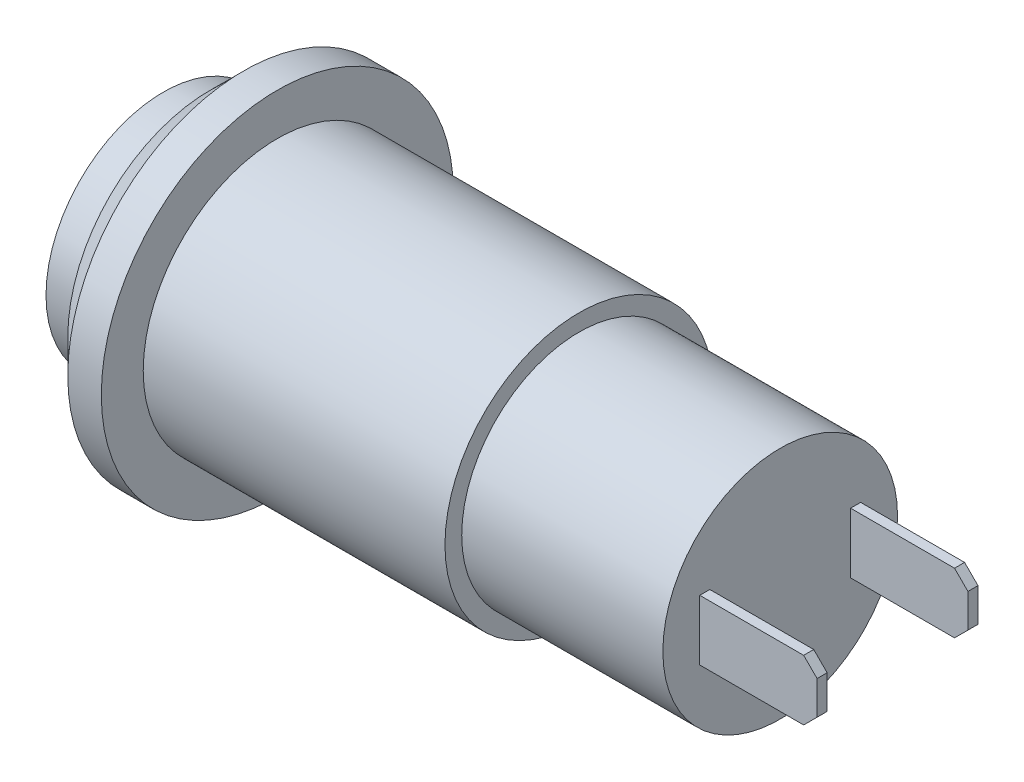
ISO-10303-21;
HEADER;
FILE_DESCRIPTION(('STEP AP214'),'2;1');
FILE_NAME('part.step','',(''),(''),'','','');
FILE_SCHEMA(('AUTOMOTIVE_DESIGN { 1 0 10303 214 1 1 1 1 }'));
ENDSEC;
DATA;
#1=APPLICATION_CONTEXT('core data for automotive mechanical design processes');
#2=APPLICATION_PROTOCOL_DEFINITION('international standard','automotive_design',2000,#1);
#3=PRODUCT_CONTEXT('',#1,'mechanical');
#4=PRODUCT('Part','Part','',(#3));
#5=PRODUCT_RELATED_PRODUCT_CATEGORY('part','',(#4));
#6=PRODUCT_DEFINITION_FORMATION('','',#4);
#7=PRODUCT_DEFINITION_CONTEXT('part definition',#1,'design');
#8=PRODUCT_DEFINITION('design','',#6,#7);
#9=PRODUCT_DEFINITION_SHAPE('','',#8);
#10=(LENGTH_UNIT() NAMED_UNIT(*) SI_UNIT(.MILLI.,.METRE.));
#11=(NAMED_UNIT(*) PLANE_ANGLE_UNIT() SI_UNIT($,.RADIAN.));
#12=(NAMED_UNIT(*) SI_UNIT($,.STERADIAN.) SOLID_ANGLE_UNIT());
#13=UNCERTAINTY_MEASURE_WITH_UNIT(LENGTH_MEASURE(1.E-05),#10,'distance_accuracy_value','');
#14=(GEOMETRIC_REPRESENTATION_CONTEXT(3) GLOBAL_UNCERTAINTY_ASSIGNED_CONTEXT((#13)) GLOBAL_UNIT_ASSIGNED_CONTEXT((#10,
#11,#12)) REPRESENTATION_CONTEXT('',''));
#15=CARTESIAN_POINT('',(0.,0.,0.));
#16=DIRECTION('',(0.,0.,1.));
#17=DIRECTION('',(1.,0.,0.));
#18=AXIS2_PLACEMENT_3D('',#15,#16,#17);
#19=CARTESIAN_POINT('',(18.4,3.5,0.));
#20=DIRECTION('',(1.,0.,0.));
#21=DIRECTION('',(0.,0.,-1.));
#22=AXIS2_PLACEMENT_3D('',#19,#20,#21);
#23=PLANE('',#22);
#24=CARTESIAN_POINT('',(18.4,0.,0.));
#25=DIRECTION('',(1.,0.,0.));
#26=DIRECTION('',(0.,0.,-1.));
#27=AXIS2_PLACEMENT_3D('',#24,#25,#26);
#28=CIRCLE('',#27,3.5);
#29=CARTESIAN_POINT('',(18.4,0.,-3.5));
#30=VERTEX_POINT('',#29);
#31=EDGE_CURVE('E214',#30,#30,#28,.T.);
#32=ORIENTED_EDGE('',*,*,#31,.T.);
#33=EDGE_LOOP('',(#32));
#34=FACE_BOUND('',#33,.T.);
#35=DIRECTION('',(0.,0.,1.));
#36=VECTOR('',#35,1.);
#37=CARTESIAN_POINT('',(18.4,0.900000000000001,2.4));
#38=LINE('',#37,#36);
#39=CARTESIAN_POINT('',(18.4,0.900000000000001,2.1));
#40=VERTEX_POINT('',#39);
#41=CARTESIAN_POINT('',(18.4,0.900000000000001,2.4));
#42=VERTEX_POINT('',#41);
#43=EDGE_CURVE('E172',#40,#42,#38,.T.);
#44=ORIENTED_EDGE('',*,*,#43,.F.);
#45=DIRECTION('',(0.,1.,0.));
#46=VECTOR('',#45,1.);
#47=CARTESIAN_POINT('',(18.4,0.900000000000001,2.1));
#48=LINE('',#47,#46);
#49=CARTESIAN_POINT('',(18.4,-0.899999999999998,2.1));
#50=VERTEX_POINT('',#49);
#51=EDGE_CURVE('E167',#50,#40,#48,.T.);
#52=ORIENTED_EDGE('',*,*,#51,.F.);
#53=DIRECTION('',(0.,0.,-1.));
#54=VECTOR('',#53,1.);
#55=CARTESIAN_POINT('',(18.4,-0.899999999999999,2.4));
#56=LINE('',#55,#54);
#57=CARTESIAN_POINT('',(18.4,-0.899999999999999,2.4));
#58=VERTEX_POINT('',#57);
#59=EDGE_CURVE('E188',#58,#50,#56,.T.);
#60=ORIENTED_EDGE('',*,*,#59,.F.);
#61=DIRECTION('',(0.,-1.,0.));
#62=VECTOR('',#61,1.);
#63=CARTESIAN_POINT('',(18.4,0.900000000000001,2.4));
#64=LINE('',#63,#62);
#65=EDGE_CURVE('E196',#42,#58,#64,.T.);
#66=ORIENTED_EDGE('',*,*,#65,.F.);
#67=EDGE_LOOP('',(#44,#52,#60,#66));
#68=FACE_BOUND('',#67,.T.);
#69=DIRECTION('',(0.,0.,1.));
#70=VECTOR('',#69,1.);
#71=CARTESIAN_POINT('',(18.4,0.900000000000001,-2.1));
#72=LINE('',#71,#70);
#73=CARTESIAN_POINT('',(18.4,0.900000000000002,-2.4));
#74=VERTEX_POINT('',#73);
#75=CARTESIAN_POINT('',(18.4,0.900000000000001,-2.1));
#76=VERTEX_POINT('',#75);
#77=EDGE_CURVE('E165',#74,#76,#72,.T.);
#78=ORIENTED_EDGE('',*,*,#77,.F.);
#79=DIRECTION('',(0.,1.,0.));
#80=VECTOR('',#79,1.);
#81=CARTESIAN_POINT('',(18.4,0.900000000000002,-2.4));
#82=LINE('',#81,#80);
#83=CARTESIAN_POINT('',(18.4,-0.899999999999998,-2.4));
#84=VERTEX_POINT('',#83);
#85=EDGE_CURVE('E144',#84,#74,#82,.T.);
#86=ORIENTED_EDGE('',*,*,#85,.F.);
#87=DIRECTION('',(0.,0.,-1.));
#88=VECTOR('',#87,1.);
#89=CARTESIAN_POINT('',(18.4,-0.899999999999998,-2.1));
#90=LINE('',#89,#88);
#91=CARTESIAN_POINT('',(18.4,-0.899999999999998,-2.1));
#92=VERTEX_POINT('',#91);
#93=EDGE_CURVE('E154',#92,#84,#90,.T.);
#94=ORIENTED_EDGE('',*,*,#93,.F.);
#95=DIRECTION('',(0.,-1.,0.));
#96=VECTOR('',#95,1.);
#97=CARTESIAN_POINT('',(18.4,0.900000000000001,-2.1));
#98=LINE('',#97,#96);
#99=EDGE_CURVE('E161',#76,#92,#98,.T.);
#100=ORIENTED_EDGE('',*,*,#99,.F.);
#101=EDGE_LOOP('',(#78,#86,#94,#100));
#102=FACE_BOUND('',#101,.T.);
#103=ADVANCED_FACE('F47',(#34,#68,#102),#23,.T.);
#104=CARTESIAN_POINT('',(0.,0.,0.));
#105=DIRECTION('',(-1.,0.,0.));
#106=DIRECTION('',(0.,0.,1.));
#107=AXIS2_PLACEMENT_3D('',#104,#105,#106);
#108=PLANE('',#107);
#109=CARTESIAN_POINT('',(0.,0.,0.));
#110=DIRECTION('',(1.,0.,0.));
#111=DIRECTION('',(0.,0.,-1.));
#112=AXIS2_PLACEMENT_3D('',#109,#110,#111);
#113=CIRCLE('',#112,3.5);
#114=CARTESIAN_POINT('',(0.,0.,-3.5));
#115=VERTEX_POINT('',#114);
#116=EDGE_CURVE('E238',#115,#115,#113,.T.);
#117=ORIENTED_EDGE('',*,*,#116,.F.);
#118=EDGE_LOOP('',(#117));
#119=FACE_BOUND('',#118,.T.);
#120=ADVANCED_FACE('F326',(#119),#108,.T.);
#121=CARTESIAN_POINT('',(18.4,0.,0.));
#122=DIRECTION('',(1.,0.,0.));
#123=DIRECTION('',(0.,0.,-1.));
#124=AXIS2_PLACEMENT_3D('',#121,#122,#123);
#125=CYLINDRICAL_SURFACE('',#124,3.5);
#126=ORIENTED_EDGE('',*,*,#116,.T.);
#127=EDGE_LOOP('',(#126));
#128=FACE_BOUND('',#127,.T.);
#129=CARTESIAN_POINT('',(1.4,0.,0.));
#130=DIRECTION('',(1.,0.,0.));
#131=DIRECTION('',(0.,0.,-1.));
#132=AXIS2_PLACEMENT_3D('',#129,#130,#131);
#133=CIRCLE('',#132,3.5);
#134=CARTESIAN_POINT('',(1.4,0.,-3.5));
#135=VERTEX_POINT('',#134);
#136=EDGE_CURVE('E234',#135,#135,#133,.T.);
#137=ORIENTED_EDGE('',*,*,#136,.F.);
#138=EDGE_LOOP('',(#137));
#139=FACE_BOUND('',#138,.T.);
#140=ADVANCED_FACE('F332',(#128,#139),#125,.T.);
#141=CARTESIAN_POINT('',(1.4,3.5,0.));
#142=DIRECTION('',(-1.,0.,0.));
#143=DIRECTION('',(0.,0.,1.));
#144=AXIS2_PLACEMENT_3D('',#141,#142,#143);
#145=PLANE('',#144);
#146=CARTESIAN_POINT('',(1.4,0.,0.));
#147=DIRECTION('',(-1.,0.,0.));
#148=DIRECTION('',(0.,0.,1.));
#149=AXIS2_PLACEMENT_3D('',#146,#147,#148);
#150=CIRCLE('',#149,4.25000000000001);
#151=CARTESIAN_POINT('',(1.4,0.,4.25000000000001));
#152=VERTEX_POINT('',#151);
#153=EDGE_CURVE('E246',#152,#152,#150,.T.);
#154=ORIENTED_EDGE('',*,*,#153,.T.);
#155=EDGE_LOOP('',(#154));
#156=FACE_BOUND('',#155,.T.);
#157=ORIENTED_EDGE('',*,*,#136,.T.);
#158=EDGE_LOOP('',(#157));
#159=FACE_BOUND('',#158,.T.);
#160=ADVANCED_FACE('F355',(#156,#159),#145,.T.);
#161=CARTESIAN_POINT('',(18.4,0.,0.));
#162=DIRECTION('',(1.,0.,0.));
#163=DIRECTION('',(0.,0.,-1.));
#164=AXIS2_PLACEMENT_3D('',#161,#162,#163);
#165=CYLINDRICAL_SURFACE('',#164,5.25);
#166=CARTESIAN_POINT('',(2.39999999999999,0.,0.));
#167=DIRECTION('',(-1.,0.,0.));
#168=DIRECTION('',(0.,0.,1.));
#169=AXIS2_PLACEMENT_3D('',#166,#167,#168);
#170=CIRCLE('',#169,5.25);
#171=CARTESIAN_POINT('',(2.39999999999999,0.,5.25));
#172=VERTEX_POINT('',#171);
#173=EDGE_CURVE('E242',#172,#172,#170,.F.);
#174=ORIENTED_EDGE('',*,*,#173,.T.);
#175=EDGE_LOOP('',(#174));
#176=FACE_BOUND('',#175,.T.);
#177=CARTESIAN_POINT('',(3.4,0.,0.));
#178=DIRECTION('',(1.,0.,0.));
#179=DIRECTION('',(0.,0.,-1.));
#180=AXIS2_PLACEMENT_3D('',#177,#178,#179);
#181=CIRCLE('',#180,5.25);
#182=CARTESIAN_POINT('',(3.4,0.,-5.25));
#183=VERTEX_POINT('',#182);
#184=EDGE_CURVE('E230',#183,#183,#181,.T.);
#185=ORIENTED_EDGE('',*,*,#184,.F.);
#186=EDGE_LOOP('',(#185));
#187=FACE_BOUND('',#186,.T.);
#188=ADVANCED_FACE('F351',(#176,#187),#165,.T.);
#189=CARTESIAN_POINT('',(3.4,5.25,0.));
#190=DIRECTION('',(1.,0.,0.));
#191=DIRECTION('',(0.,0.,-1.));
#192=AXIS2_PLACEMENT_3D('',#189,#190,#191);
#193=PLANE('',#192);
#194=ORIENTED_EDGE('',*,*,#184,.T.);
#195=EDGE_LOOP('',(#194));
#196=FACE_BOUND('',#195,.T.);
#197=CARTESIAN_POINT('',(3.4,0.,0.));
#198=DIRECTION('',(1.,0.,0.));
#199=DIRECTION('',(0.,0.,-1.));
#200=AXIS2_PLACEMENT_3D('',#197,#198,#199);
#201=CIRCLE('',#200,4.);
#202=CARTESIAN_POINT('',(3.4,0.,-4.));
#203=VERTEX_POINT('',#202);
#204=EDGE_CURVE('E226',#203,#203,#201,.T.);
#205=ORIENTED_EDGE('',*,*,#204,.F.);
#206=EDGE_LOOP('',(#205));
#207=FACE_BOUND('',#206,.T.);
#208=ADVANCED_FACE('F347',(#196,#207),#193,.T.);
#209=CARTESIAN_POINT('',(18.4,0.,0.));
#210=DIRECTION('',(1.,0.,0.));
#211=DIRECTION('',(0.,0.,-1.));
#212=AXIS2_PLACEMENT_3D('',#209,#210,#211);
#213=CYLINDRICAL_SURFACE('',#212,4.);
#214=ORIENTED_EDGE('',*,*,#204,.T.);
#215=EDGE_LOOP('',(#214));
#216=FACE_BOUND('',#215,.T.);
#217=CARTESIAN_POINT('',(12.4,0.,0.));
#218=DIRECTION('',(1.,0.,0.));
#219=DIRECTION('',(0.,0.,-1.));
#220=AXIS2_PLACEMENT_3D('',#217,#218,#219);
#221=CIRCLE('',#220,4.);
#222=CARTESIAN_POINT('',(12.4,0.,-4.));
#223=VERTEX_POINT('',#222);
#224=EDGE_CURVE('E222',#223,#223,#221,.T.);
#225=ORIENTED_EDGE('',*,*,#224,.F.);
#226=EDGE_LOOP('',(#225));
#227=FACE_BOUND('',#226,.T.);
#228=ADVANCED_FACE('F343',(#216,#227),#213,.T.);
#229=CARTESIAN_POINT('',(12.4,4.,0.));
#230=DIRECTION('',(1.,0.,0.));
#231=DIRECTION('',(0.,0.,-1.));
#232=AXIS2_PLACEMENT_3D('',#229,#230,#231);
#233=PLANE('',#232);
#234=ORIENTED_EDGE('',*,*,#224,.T.);
#235=EDGE_LOOP('',(#234));
#236=FACE_BOUND('',#235,.T.);
#237=CARTESIAN_POINT('',(12.4,0.,0.));
#238=DIRECTION('',(1.,0.,0.));
#239=DIRECTION('',(0.,0.,-1.));
#240=AXIS2_PLACEMENT_3D('',#237,#238,#239);
#241=CIRCLE('',#240,3.5);
#242=CARTESIAN_POINT('',(12.4,0.,-3.5));
#243=VERTEX_POINT('',#242);
#244=EDGE_CURVE('E218',#243,#243,#241,.T.);
#245=ORIENTED_EDGE('',*,*,#244,.F.);
#246=EDGE_LOOP('',(#245));
#247=FACE_BOUND('',#246,.T.);
#248=ADVANCED_FACE('F339',(#236,#247),#233,.T.);
#249=CARTESIAN_POINT('',(18.4,0.,0.));
#250=DIRECTION('',(1.,0.,0.));
#251=DIRECTION('',(0.,0.,-1.));
#252=AXIS2_PLACEMENT_3D('',#249,#250,#251);
#253=CYLINDRICAL_SURFACE('',#252,3.5);
#254=ORIENTED_EDGE('',*,*,#244,.T.);
#255=EDGE_LOOP('',(#254));
#256=FACE_BOUND('',#255,.T.);
#257=ORIENTED_EDGE('',*,*,#31,.F.);
#258=EDGE_LOOP('',(#257));
#259=FACE_BOUND('',#258,.T.);
#260=ADVANCED_FACE('F336',(#256,#259),#253,.T.);
#261=CARTESIAN_POINT('',(2.39999999999999,0.,0.));
#262=DIRECTION('',(1.,0.,0.));
#263=DIRECTION('',(0.,0.,-1.));
#264=AXIS2_PLACEMENT_3D('',#261,#262,#263);
#265=CONICAL_SURFACE('',#264,5.25,0.785398163397449);
#266=ORIENTED_EDGE('',*,*,#153,.F.);
#267=EDGE_LOOP('',(#266));
#268=FACE_BOUND('',#267,.T.);
#269=ORIENTED_EDGE('',*,*,#173,.F.);
#270=EDGE_LOOP('',(#269));
#271=FACE_BOUND('',#270,.T.);
#272=ADVANCED_FACE('F323',(#268,#271),#265,.T.);
#273=CARTESIAN_POINT('',(21.9,0.900000000000001,2.1));
#274=DIRECTION('',(0.,0.,1.));
#275=DIRECTION('',(1.,0.,0.));
#276=AXIS2_PLACEMENT_3D('',#273,#274,#275);
#277=PLANE('',#276);
#278=DIRECTION('',(0.,1.,0.));
#279=VECTOR('',#278,1.);
#280=CARTESIAN_POINT('',(21.9,0.900000000000001,2.1));
#281=LINE('',#280,#279);
#282=CARTESIAN_POINT('',(21.9,-0.500000000000001,2.1));
#283=VERTEX_POINT('',#282);
#284=CARTESIAN_POINT('',(21.9,0.5,2.1));
#285=VERTEX_POINT('',#284);
#286=EDGE_CURVE('E183',#283,#285,#281,.T.);
#287=ORIENTED_EDGE('',*,*,#286,.F.);
#288=DIRECTION('',(-0.707106781186551,-0.707106781186544,0.));
#289=VECTOR('',#288,1.);
#290=CARTESIAN_POINT('',(21.9,-0.499999999999999,2.1));
#291=LINE('',#290,#289);
#292=CARTESIAN_POINT('',(21.5,-0.899999999999998,2.1));
#293=VERTEX_POINT('',#292);
#294=EDGE_CURVE('E286',#283,#293,#291,.T.);
#295=ORIENTED_EDGE('',*,*,#294,.T.);
#296=DIRECTION('',(-1.,0.,0.));
#297=VECTOR('',#296,1.);
#298=CARTESIAN_POINT('',(21.9,-0.899999999999998,2.1));
#299=LINE('',#298,#297);
#300=EDGE_CURVE('E191',#293,#50,#299,.T.);
#301=ORIENTED_EDGE('',*,*,#300,.T.);
#302=ORIENTED_EDGE('',*,*,#51,.T.);
#303=DIRECTION('',(-1.,0.,0.));
#304=VECTOR('',#303,1.);
#305=CARTESIAN_POINT('',(21.9,0.900000000000001,2.1));
#306=LINE('',#305,#304);
#307=CARTESIAN_POINT('',(21.5,0.900000000000001,2.1));
#308=VERTEX_POINT('',#307);
#309=EDGE_CURVE('E211',#308,#40,#306,.T.);
#310=ORIENTED_EDGE('',*,*,#309,.F.);
#311=DIRECTION('',(0.707106781186548,-0.707106781186548,0.));
#312=VECTOR('',#311,1.);
#313=CARTESIAN_POINT('',(21.9,0.5,2.1));
#314=LINE('',#313,#312);
#315=EDGE_CURVE('E283',#308,#285,#314,.T.);
#316=ORIENTED_EDGE('',*,*,#315,.T.);
#317=EDGE_LOOP('',(#287,#295,#301,#302,#310,#316));
#318=FACE_BOUND('',#317,.T.);
#319=ADVANCED_FACE('F303',(#318),#277,.F.);
#320=CARTESIAN_POINT('',(21.9,0.900000000000001,2.4));
#321=DIRECTION('',(0.,-1.,0.));
#322=DIRECTION('',(0.,0.,-1.));
#323=AXIS2_PLACEMENT_3D('',#320,#321,#322);
#324=PLANE('',#323);
#325=DIRECTION('',(-1.,0.,0.));
#326=VECTOR('',#325,1.);
#327=CARTESIAN_POINT('',(21.9,0.900000000000001,2.4));
#328=LINE('',#327,#326);
#329=CARTESIAN_POINT('',(21.5,0.900000000000001,2.4));
#330=VERTEX_POINT('',#329);
#331=EDGE_CURVE('E208',#330,#42,#328,.T.);
#332=ORIENTED_EDGE('',*,*,#331,.F.);
#333=DIRECTION('',(0.,0.,-1.));
#334=VECTOR('',#333,1.);
#335=CARTESIAN_POINT('',(21.5,0.900000000000001,2.1));
#336=LINE('',#335,#334);
#337=EDGE_CURVE('E11',#330,#308,#336,.T.);
#338=ORIENTED_EDGE('',*,*,#337,.T.);
#339=ORIENTED_EDGE('',*,*,#309,.T.);
#340=ORIENTED_EDGE('',*,*,#43,.T.);
#341=EDGE_LOOP('',(#332,#338,#339,#340));
#342=FACE_BOUND('',#341,.T.);
#343=ADVANCED_FACE('F315',(#342),#324,.F.);
#344=CARTESIAN_POINT('',(21.9,0.900000000000001,2.4));
#345=DIRECTION('',(0.,0.,-1.));
#346=DIRECTION('',(-1.,0.,0.));
#347=AXIS2_PLACEMENT_3D('',#344,#345,#346);
#348=PLANE('',#347);
#349=DIRECTION('',(-1.,0.,0.));
#350=VECTOR('',#349,1.);
#351=CARTESIAN_POINT('',(21.9,-0.899999999999999,2.4));
#352=LINE('',#351,#350);
#353=CARTESIAN_POINT('',(21.5,-0.899999999999999,2.4));
#354=VERTEX_POINT('',#353);
#355=EDGE_CURVE('E205',#354,#58,#352,.T.);
#356=ORIENTED_EDGE('',*,*,#355,.F.);
#357=DIRECTION('',(0.707106781186551,0.707106781186544,0.));
#358=VECTOR('',#357,1.);
#359=CARTESIAN_POINT('',(21.9,-0.499999999999999,2.4));
#360=LINE('',#359,#358);
#361=CARTESIAN_POINT('',(21.9,-0.500000000000001,2.4));
#362=VERTEX_POINT('',#361);
#363=EDGE_CURVE('E57',#354,#362,#360,.T.);
#364=ORIENTED_EDGE('',*,*,#363,.T.);
#365=DIRECTION('',(0.,-1.,0.));
#366=VECTOR('',#365,1.);
#367=CARTESIAN_POINT('',(21.9,0.900000000000001,2.4));
#368=LINE('',#367,#366);
#369=CARTESIAN_POINT('',(21.9,0.5,2.4));
#370=VERTEX_POINT('',#369);
#371=EDGE_CURVE('E187',#370,#362,#368,.T.);
#372=ORIENTED_EDGE('',*,*,#371,.F.);
#373=DIRECTION('',(-0.707106781186548,0.707106781186548,0.));
#374=VECTOR('',#373,1.);
#375=CARTESIAN_POINT('',(21.9,0.5,2.4));
#376=LINE('',#375,#374);
#377=EDGE_CURVE('E64',#370,#330,#376,.T.);
#378=ORIENTED_EDGE('',*,*,#377,.T.);
#379=ORIENTED_EDGE('',*,*,#331,.T.);
#380=ORIENTED_EDGE('',*,*,#65,.T.);
#381=EDGE_LOOP('',(#356,#364,#372,#378,#379,#380));
#382=FACE_BOUND('',#381,.T.);
#383=ADVANCED_FACE('F294',(#382),#348,.F.);
#384=CARTESIAN_POINT('',(21.9,-0.899999999999999,2.4));
#385=DIRECTION('',(0.,1.,0.));
#386=DIRECTION('',(0.,0.,1.));
#387=AXIS2_PLACEMENT_3D('',#384,#385,#386);
#388=PLANE('',#387);
#389=ORIENTED_EDGE('',*,*,#300,.F.);
#390=DIRECTION('',(0.,0.,1.));
#391=VECTOR('',#390,1.);
#392=CARTESIAN_POINT('',(21.5,-0.899999999999999,2.4));
#393=LINE('',#392,#391);
#394=EDGE_CURVE('E72',#293,#354,#393,.T.);
#395=ORIENTED_EDGE('',*,*,#394,.T.);
#396=ORIENTED_EDGE('',*,*,#355,.T.);
#397=ORIENTED_EDGE('',*,*,#59,.T.);
#398=EDGE_LOOP('',(#389,#395,#396,#397));
#399=FACE_BOUND('',#398,.T.);
#400=ADVANCED_FACE('F304',(#399),#388,.F.);
#401=CARTESIAN_POINT('',(21.9,0.,0.));
#402=DIRECTION('',(1.,0.,0.));
#403=DIRECTION('',(0.,0.,-1.));
#404=AXIS2_PLACEMENT_3D('',#401,#402,#403);
#405=PLANE('',#404);
#406=ORIENTED_EDGE('',*,*,#371,.T.);
#407=DIRECTION('',(0.,0.,-1.));
#408=VECTOR('',#407,1.);
#409=CARTESIAN_POINT('',(21.9,-0.500000000000001,2.1));
#410=LINE('',#409,#408);
#411=EDGE_CURVE('E279',#362,#283,#410,.T.);
#412=ORIENTED_EDGE('',*,*,#411,.T.);
#413=ORIENTED_EDGE('',*,*,#286,.T.);
#414=DIRECTION('',(0.,0.,1.));
#415=VECTOR('',#414,1.);
#416=CARTESIAN_POINT('',(21.9,0.5,2.4));
#417=LINE('',#416,#415);
#418=EDGE_CURVE('E275',#285,#370,#417,.T.);
#419=ORIENTED_EDGE('',*,*,#418,.T.);
#420=EDGE_LOOP('',(#406,#412,#413,#419));
#421=FACE_BOUND('',#420,.T.);
#422=ADVANCED_FACE('F298',(#421),#405,.T.);
#423=CARTESIAN_POINT('',(21.9,0.900000000000002,-2.4));
#424=DIRECTION('',(0.,0.,1.));
#425=DIRECTION('',(1.,0.,0.));
#426=AXIS2_PLACEMENT_3D('',#423,#424,#425);
#427=PLANE('',#426);
#428=DIRECTION('',(0.,1.,0.));
#429=VECTOR('',#428,1.);
#430=CARTESIAN_POINT('',(21.9,0.900000000000002,-2.4));
#431=LINE('',#430,#429);
#432=CARTESIAN_POINT('',(21.9,-0.500000000000001,-2.4));
#433=VERTEX_POINT('',#432);
#434=CARTESIAN_POINT('',(21.9,0.500000000000004,-2.4));
#435=VERTEX_POINT('',#434);
#436=EDGE_CURVE('E162',#433,#435,#431,.T.);
#437=ORIENTED_EDGE('',*,*,#436,.F.);
#438=DIRECTION('',(-0.707106781186551,-0.707106781186544,0.));
#439=VECTOR('',#438,1.);
#440=CARTESIAN_POINT('',(21.9,-0.500000000000001,-2.4));
#441=LINE('',#440,#439);
#442=CARTESIAN_POINT('',(21.5,-0.899999999999998,-2.4));
#443=VERTEX_POINT('',#442);
#444=EDGE_CURVE('E146',#433,#443,#441,.T.);
#445=ORIENTED_EDGE('',*,*,#444,.T.);
#446=DIRECTION('',(-1.,0.,0.));
#447=VECTOR('',#446,1.);
#448=CARTESIAN_POINT('',(21.9,-0.899999999999998,-2.4));
#449=LINE('',#448,#447);
#450=EDGE_CURVE('E138',#443,#84,#449,.T.);
#451=ORIENTED_EDGE('',*,*,#450,.T.);
#452=ORIENTED_EDGE('',*,*,#85,.T.);
#453=DIRECTION('',(-1.,0.,0.));
#454=VECTOR('',#453,1.);
#455=CARTESIAN_POINT('',(21.9,0.900000000000002,-2.4));
#456=LINE('',#455,#454);
#457=CARTESIAN_POINT('',(21.5,0.900000000000002,-2.4));
#458=VERTEX_POINT('',#457);
#459=EDGE_CURVE('E601',#458,#74,#456,.T.);
#460=ORIENTED_EDGE('',*,*,#459,.F.);
#461=DIRECTION('',(0.707106781186551,-0.707106781186544,0.));
#462=VECTOR('',#461,1.);
#463=CARTESIAN_POINT('',(21.9,0.500000000000001,-2.4));
#464=LINE('',#463,#462);
#465=EDGE_CURVE('E258',#458,#435,#464,.T.);
#466=ORIENTED_EDGE('',*,*,#465,.T.);
#467=EDGE_LOOP('',(#437,#445,#451,#452,#460,#466));
#468=FACE_BOUND('',#467,.T.);
#469=ADVANCED_FACE('F141',(#468),#427,.F.);
#470=CARTESIAN_POINT('',(21.9,0.900000000000001,-2.1));
#471=DIRECTION('',(0.,-1.,0.));
#472=DIRECTION('',(0.,0.,-1.));
#473=AXIS2_PLACEMENT_3D('',#470,#471,#472);
#474=PLANE('',#473);
#475=DIRECTION('',(-1.,0.,0.));
#476=VECTOR('',#475,1.);
#477=CARTESIAN_POINT('',(21.9,0.900000000000001,-2.1));
#478=LINE('',#477,#476);
#479=CARTESIAN_POINT('',(21.5,0.900000000000001,-2.1));
#480=VERTEX_POINT('',#479);
#481=EDGE_CURVE('E598',#480,#76,#478,.T.);
#482=ORIENTED_EDGE('',*,*,#481,.F.);
#483=DIRECTION('',(0.,0.,-1.));
#484=VECTOR('',#483,1.);
#485=CARTESIAN_POINT('',(21.5,0.900000000000002,-2.4));
#486=LINE('',#485,#484);
#487=EDGE_CURVE('E272',#480,#458,#486,.T.);
#488=ORIENTED_EDGE('',*,*,#487,.T.);
#489=ORIENTED_EDGE('',*,*,#459,.T.);
#490=ORIENTED_EDGE('',*,*,#77,.T.);
#491=EDGE_LOOP('',(#482,#488,#489,#490));
#492=FACE_BOUND('',#491,.T.);
#493=ADVANCED_FACE('F441',(#492),#474,.F.);
#494=CARTESIAN_POINT('',(21.9,0.900000000000001,-2.1));
#495=DIRECTION('',(0.,0.,-1.));
#496=DIRECTION('',(-1.,0.,0.));
#497=AXIS2_PLACEMENT_3D('',#494,#495,#496);
#498=PLANE('',#497);
#499=DIRECTION('',(-1.,0.,0.));
#500=VECTOR('',#499,1.);
#501=CARTESIAN_POINT('',(21.9,-0.899999999999998,-2.1));
#502=LINE('',#501,#500);
#503=CARTESIAN_POINT('',(21.5,-0.899999999999998,-2.1));
#504=VERTEX_POINT('',#503);
#505=EDGE_CURVE('E151',#504,#92,#502,.T.);
#506=ORIENTED_EDGE('',*,*,#505,.F.);
#507=DIRECTION('',(0.707106781186551,0.707106781186544,0.));
#508=VECTOR('',#507,1.);
#509=CARTESIAN_POINT('',(21.9,-0.500000000000001,-2.1));
#510=LINE('',#509,#508);
#511=CARTESIAN_POINT('',(21.9,-0.500000000000001,-2.1));
#512=VERTEX_POINT('',#511);
#513=EDGE_CURVE('E269',#504,#512,#510,.T.);
#514=ORIENTED_EDGE('',*,*,#513,.T.);
#515=DIRECTION('',(0.,-1.,0.));
#516=VECTOR('',#515,1.);
#517=CARTESIAN_POINT('',(21.9,0.900000000000001,-2.1));
#518=LINE('',#517,#516);
#519=CARTESIAN_POINT('',(21.9,0.500000000000003,-2.1));
#520=VERTEX_POINT('',#519);
#521=EDGE_CURVE('E150',#520,#512,#518,.T.);
#522=ORIENTED_EDGE('',*,*,#521,.F.);
#523=DIRECTION('',(-0.707106781186551,0.707106781186544,0.));
#524=VECTOR('',#523,1.);
#525=CARTESIAN_POINT('',(21.9,0.500000000000001,-2.1));
#526=LINE('',#525,#524);
#527=EDGE_CURVE('E266',#520,#480,#526,.T.);
#528=ORIENTED_EDGE('',*,*,#527,.T.);
#529=ORIENTED_EDGE('',*,*,#481,.T.);
#530=ORIENTED_EDGE('',*,*,#99,.T.);
#531=EDGE_LOOP('',(#506,#514,#522,#528,#529,#530));
#532=FACE_BOUND('',#531,.T.);
#533=ADVANCED_FACE('F431',(#532),#498,.F.);
#534=CARTESIAN_POINT('',(21.9,-0.899999999999998,-2.1));
#535=DIRECTION('',(0.,1.,0.));
#536=DIRECTION('',(0.,0.,1.));
#537=AXIS2_PLACEMENT_3D('',#534,#535,#536);
#538=PLANE('',#537);
#539=ORIENTED_EDGE('',*,*,#450,.F.);
#540=DIRECTION('',(0.,0.,1.));
#541=VECTOR('',#540,1.);
#542=CARTESIAN_POINT('',(21.5,-0.899999999999998,-2.1));
#543=LINE('',#542,#541);
#544=EDGE_CURVE('E263',#443,#504,#543,.T.);
#545=ORIENTED_EDGE('',*,*,#544,.T.);
#546=ORIENTED_EDGE('',*,*,#505,.T.);
#547=ORIENTED_EDGE('',*,*,#93,.T.);
#548=EDGE_LOOP('',(#539,#545,#546,#547));
#549=FACE_BOUND('',#548,.T.);
#550=ADVANCED_FACE('F155',(#549),#538,.F.);
#551=CARTESIAN_POINT('',(21.9,0.,0.));
#552=DIRECTION('',(1.,0.,0.));
#553=DIRECTION('',(0.,0.,-1.));
#554=AXIS2_PLACEMENT_3D('',#551,#552,#553);
#555=PLANE('',#554);
#556=ORIENTED_EDGE('',*,*,#521,.T.);
#557=DIRECTION('',(0.,0.,-1.));
#558=VECTOR('',#557,1.);
#559=CARTESIAN_POINT('',(21.9,-0.500000000000001,-2.4));
#560=LINE('',#559,#558);
#561=EDGE_CURVE('E254',#512,#433,#560,.T.);
#562=ORIENTED_EDGE('',*,*,#561,.T.);
#563=ORIENTED_EDGE('',*,*,#436,.T.);
#564=DIRECTION('',(0.,0.,1.));
#565=VECTOR('',#564,1.);
#566=CARTESIAN_POINT('',(21.9,0.500000000000003,-2.1));
#567=LINE('',#566,#565);
#568=EDGE_CURVE('E250',#435,#520,#567,.T.);
#569=ORIENTED_EDGE('',*,*,#568,.T.);
#570=EDGE_LOOP('',(#556,#562,#563,#569));
#571=FACE_BOUND('',#570,.T.);
#572=ADVANCED_FACE('F377',(#571),#555,.T.);
#573=CARTESIAN_POINT('',(21.9,-0.500000000000001,0.));
#574=DIRECTION('',(0.707106781186544,-0.707106781186551,0.));
#575=DIRECTION('',(0.,0.,1.));
#576=AXIS2_PLACEMENT_3D('',#573,#574,#575);
#577=PLANE('',#576);
#578=ORIENTED_EDGE('',*,*,#513,.F.);
#579=ORIENTED_EDGE('',*,*,#544,.F.);
#580=ORIENTED_EDGE('',*,*,#444,.F.);
#581=ORIENTED_EDGE('',*,*,#561,.F.);
#582=EDGE_LOOP('',(#578,#579,#580,#581));
#583=FACE_BOUND('',#582,.T.);
#584=ADVANCED_FACE('F370',(#583),#577,.T.);
#585=CARTESIAN_POINT('',(21.9,0.499999999999999,0.));
#586=DIRECTION('',(0.707106781186544,0.707106781186551,0.));
#587=DIRECTION('',(0.,0.,-1.));
#588=AXIS2_PLACEMENT_3D('',#585,#586,#587);
#589=PLANE('',#588);
#590=ORIENTED_EDGE('',*,*,#465,.F.);
#591=ORIENTED_EDGE('',*,*,#487,.F.);
#592=ORIENTED_EDGE('',*,*,#527,.F.);
#593=ORIENTED_EDGE('',*,*,#568,.F.);
#594=EDGE_LOOP('',(#590,#591,#592,#593));
#595=FACE_BOUND('',#594,.T.);
#596=ADVANCED_FACE('F376',(#595),#589,.T.);
#597=CARTESIAN_POINT('',(21.9,-0.499999999999996,0.));
#598=DIRECTION('',(0.707106781186544,-0.707106781186551,0.));
#599=DIRECTION('',(0.,0.,1.));
#600=AXIS2_PLACEMENT_3D('',#597,#598,#599);
#601=PLANE('',#600);
#602=ORIENTED_EDGE('',*,*,#363,.F.);
#603=ORIENTED_EDGE('',*,*,#394,.F.);
#604=ORIENTED_EDGE('',*,*,#294,.F.);
#605=ORIENTED_EDGE('',*,*,#411,.F.);
#606=EDGE_LOOP('',(#602,#603,#604,#605));
#607=FACE_BOUND('',#606,.T.);
#608=ADVANCED_FACE('F301',(#607),#601,.T.);
#609=CARTESIAN_POINT('',(21.9,0.5,0.));
#610=DIRECTION('',(0.707106781186547,0.707106781186547,0.));
#611=DIRECTION('',(0.,0.,-1.));
#612=AXIS2_PLACEMENT_3D('',#609,#610,#611);
#613=PLANE('',#612);
#614=ORIENTED_EDGE('',*,*,#315,.F.);
#615=ORIENTED_EDGE('',*,*,#337,.F.);
#616=ORIENTED_EDGE('',*,*,#377,.F.);
#617=ORIENTED_EDGE('',*,*,#418,.F.);
#618=EDGE_LOOP('',(#614,#615,#616,#617));
#619=FACE_BOUND('',#618,.T.);
#620=ADVANCED_FACE('F50',(#619),#613,.T.);
#621=CLOSED_SHELL('',(#103,#120,#140,#160,#188,#208,#228,#248,#260,#272,#319,#343,#383,#400,
#422,#469,#493,#533,#550,#572,#584,#596,#608,#620));
#622=MANIFOLD_SOLID_BREP('B2',#621);
#623=ADVANCED_BREP_SHAPE_REPRESENTATION('',(#18,#622),#14);
#624=SHAPE_DEFINITION_REPRESENTATION(#9,#623);
ENDSEC;
END-ISO-10303-21;
